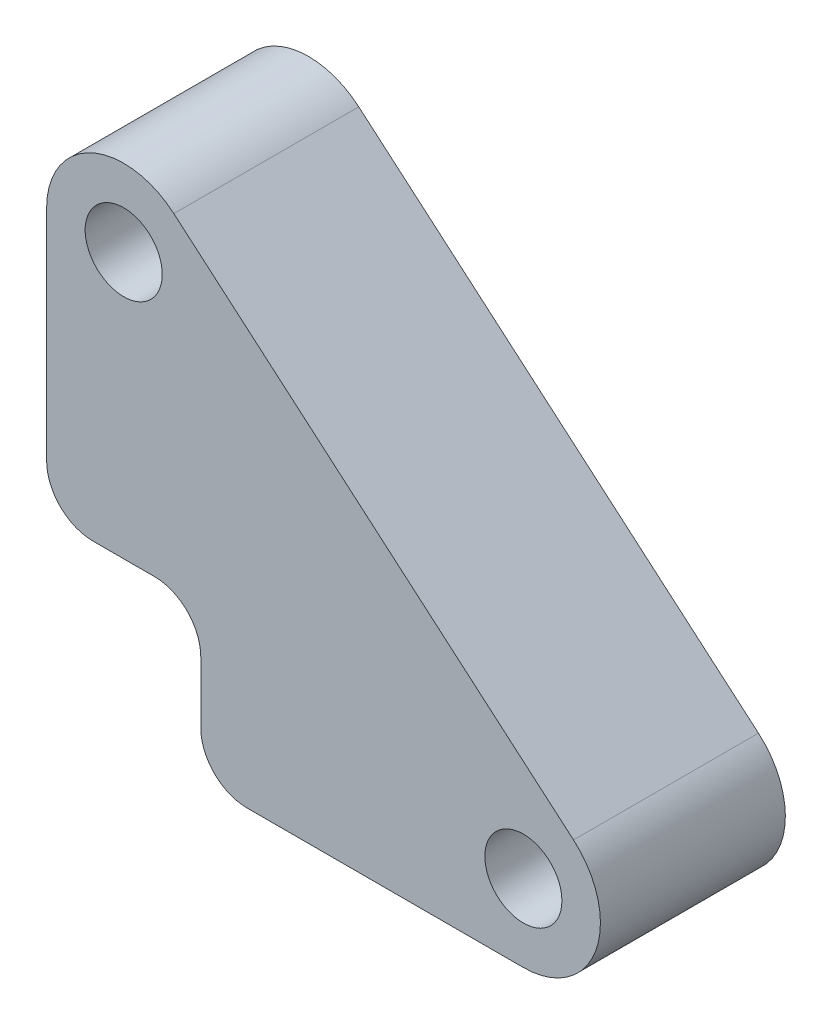
ISO-10303-21;
HEADER;
FILE_DESCRIPTION(('STEP AP214'),'2;1');
FILE_NAME('part.step','',(''),(''),'','','');
FILE_SCHEMA(('AUTOMOTIVE_DESIGN { 1 0 10303 214 1 1 1 1 }'));
ENDSEC;
DATA;
#1=APPLICATION_CONTEXT('core data for automotive mechanical design processes');
#2=APPLICATION_PROTOCOL_DEFINITION('international standard','automotive_design',2000,#1);
#3=PRODUCT_CONTEXT('',#1,'mechanical');
#4=PRODUCT('Part','Part','',(#3));
#5=PRODUCT_RELATED_PRODUCT_CATEGORY('part','',(#4));
#6=PRODUCT_DEFINITION_FORMATION('','',#4);
#7=PRODUCT_DEFINITION_CONTEXT('part definition',#1,'design');
#8=PRODUCT_DEFINITION('design','',#6,#7);
#9=PRODUCT_DEFINITION_SHAPE('','',#8);
#10=(LENGTH_UNIT() NAMED_UNIT(*) SI_UNIT(.MILLI.,.METRE.));
#11=(NAMED_UNIT(*) PLANE_ANGLE_UNIT() SI_UNIT($,.RADIAN.));
#12=(NAMED_UNIT(*) SI_UNIT($,.STERADIAN.) SOLID_ANGLE_UNIT());
#13=UNCERTAINTY_MEASURE_WITH_UNIT(LENGTH_MEASURE(1.E-05),#10,'distance_accuracy_value','');
#14=(GEOMETRIC_REPRESENTATION_CONTEXT(3) GLOBAL_UNCERTAINTY_ASSIGNED_CONTEXT((#13)) GLOBAL_UNIT_ASSIGNED_CONTEXT((#10,
#11,#12)) REPRESENTATION_CONTEXT('',''));
#15=CARTESIAN_POINT('',(0.,0.,0.));
#16=DIRECTION('',(0.,0.,1.));
#17=DIRECTION('',(1.,0.,0.));
#18=AXIS2_PLACEMENT_3D('',#15,#16,#17);
#19=CARTESIAN_POINT('',(61.8674259045119,0.,24.));
#20=DIRECTION('',(0.,1.,0.));
#21=DIRECTION('',(-1.,0.,0.));
#22=AXIS2_PLACEMENT_3D('',#19,#20,#21);
#23=PLANE('',#22);
#24=DIRECTION('',(1.,0.,0.));
#25=VECTOR('',#24,1.);
#26=CARTESIAN_POINT('',(61.8674259045119,0.,24.));
#27=LINE('',#26,#25);
#28=CARTESIAN_POINT('',(26.,0.,24.));
#29=VERTEX_POINT('',#28);
#30=CARTESIAN_POINT('',(61.8674259045119,0.,24.));
#31=VERTEX_POINT('',#30);
#32=EDGE_CURVE('E166',#29,#31,#27,.T.);
#33=ORIENTED_EDGE('',*,*,#32,.F.);
#34=DIRECTION('',(0.,0.,-1.));
#35=VECTOR('',#34,1.);
#36=CARTESIAN_POINT('',(26.,0.,24.));
#37=LINE('',#36,#35);
#38=CARTESIAN_POINT('',(26.,0.,0.));
#39=VERTEX_POINT('',#38);
#40=EDGE_CURVE('E47',#29,#39,#37,.T.);
#41=ORIENTED_EDGE('',*,*,#40,.T.);
#42=DIRECTION('',(1.,0.,0.));
#43=VECTOR('',#42,1.);
#44=CARTESIAN_POINT('',(61.8674259045119,0.,0.));
#45=LINE('',#44,#43);
#46=CARTESIAN_POINT('',(61.8674259045119,0.,0.));
#47=VERTEX_POINT('',#46);
#48=EDGE_CURVE('E156',#39,#47,#45,.T.);
#49=ORIENTED_EDGE('',*,*,#48,.T.);
#50=DIRECTION('',(0.,0.,-1.));
#51=VECTOR('',#50,1.);
#52=CARTESIAN_POINT('',(61.8674259045119,0.,24.));
#53=LINE('',#52,#51);
#54=EDGE_CURVE('E198',#31,#47,#53,.T.);
#55=ORIENTED_EDGE('',*,*,#54,.F.);
#56=EDGE_LOOP('',(#33,#41,#49,#55));
#57=FACE_BOUND('',#56,.T.);
#58=ADVANCED_FACE('F38',(#57),#23,.F.);
#59=CARTESIAN_POINT('',(61.8674259045119,10.,24.));
#60=DIRECTION('',(0.,0.,-1.));
#61=DIRECTION('',(-1.,0.,0.));
#62=AXIS2_PLACEMENT_3D('',#59,#60,#61);
#63=CYLINDRICAL_SURFACE('',#62,10.);
#64=CARTESIAN_POINT('',(61.8674259045119,10.,0.));
#65=DIRECTION('',(0.,0.,1.));
#66=DIRECTION('',(-1.,0.,0.));
#67=AXIS2_PLACEMENT_3D('',#64,#65,#66);
#68=CIRCLE('',#67,10.);
#69=CARTESIAN_POINT('',(68.3753396390715,17.592566023653,0.));
#70=VERTEX_POINT('',#69);
#71=EDGE_CURVE('E179',#47,#70,#68,.T.);
#72=ORIENTED_EDGE('',*,*,#71,.T.);
#73=DIRECTION('',(0.,0.,-1.));
#74=VECTOR('',#73,1.);
#75=CARTESIAN_POINT('',(68.3753396390715,17.592566023653,24.));
#76=LINE('',#75,#74);
#77=CARTESIAN_POINT('',(68.3753396390715,17.592566023653,24.));
#78=VERTEX_POINT('',#77);
#79=EDGE_CURVE('E194',#78,#70,#76,.T.);
#80=ORIENTED_EDGE('',*,*,#79,.F.);
#81=CARTESIAN_POINT('',(61.8674259045119,10.,24.));
#82=DIRECTION('',(0.,0.,1.));
#83=DIRECTION('',(-1.,0.,0.));
#84=AXIS2_PLACEMENT_3D('',#81,#82,#83);
#85=CIRCLE('',#84,10.);
#86=EDGE_CURVE('E168',#31,#78,#85,.T.);
#87=ORIENTED_EDGE('',*,*,#86,.F.);
#88=ORIENTED_EDGE('',*,*,#54,.T.);
#89=EDGE_LOOP('',(#72,#80,#87,#88));
#90=FACE_BOUND('',#89,.T.);
#91=ADVANCED_FACE('F225',(#90),#63,.T.);
#92=CARTESIAN_POINT('',(16.5079137345597,62.0503596560917,24.));
#93=DIRECTION('',(-0.650791373455969,-0.759256602365296,0.));
#94=DIRECTION('',(0.759256602365296,-0.650791373455969,0.));
#95=AXIS2_PLACEMENT_3D('',#92,#93,#94);
#96=PLANE('',#95);
#97=DIRECTION('',(-0.759256602365296,0.650791373455969,0.));
#98=VECTOR('',#97,1.);
#99=CARTESIAN_POINT('',(16.5079137345597,62.0503596560917,0.));
#100=LINE('',#99,#98);
#101=CARTESIAN_POINT('',(16.5079137345597,62.0503596560917,0.));
#102=VERTEX_POINT('',#101);
#103=EDGE_CURVE('E182',#70,#102,#100,.T.);
#104=ORIENTED_EDGE('',*,*,#103,.T.);
#105=DIRECTION('',(0.,0.,-1.));
#106=VECTOR('',#105,1.);
#107=CARTESIAN_POINT('',(16.5079137345597,62.0503596560917,24.));
#108=LINE('',#107,#106);
#109=CARTESIAN_POINT('',(16.5079137345597,62.0503596560917,24.));
#110=VERTEX_POINT('',#109);
#111=EDGE_CURVE('E191',#110,#102,#108,.T.);
#112=ORIENTED_EDGE('',*,*,#111,.F.);
#113=DIRECTION('',(-0.759256602365296,0.650791373455969,0.));
#114=VECTOR('',#113,1.);
#115=CARTESIAN_POINT('',(16.5079137345597,62.0503596560917,24.));
#116=LINE('',#115,#114);
#117=EDGE_CURVE('E171',#78,#110,#116,.T.);
#118=ORIENTED_EDGE('',*,*,#117,.F.);
#119=ORIENTED_EDGE('',*,*,#79,.T.);
#120=EDGE_LOOP('',(#104,#112,#118,#119));
#121=FACE_BOUND('',#120,.T.);
#122=ADVANCED_FACE('F229',(#121),#96,.F.);
#123=CARTESIAN_POINT('',(10.,54.4577936324387,24.));
#124=DIRECTION('',(0.,0.,-1.));
#125=DIRECTION('',(-1.,0.,0.));
#126=AXIS2_PLACEMENT_3D('',#123,#124,#125);
#127=CYLINDRICAL_SURFACE('',#126,10.);
#128=CARTESIAN_POINT('',(10.,54.4577936324387,0.));
#129=DIRECTION('',(0.,0.,1.));
#130=DIRECTION('',(-1.,0.,0.));
#131=AXIS2_PLACEMENT_3D('',#128,#129,#130);
#132=CIRCLE('',#131,10.);
#133=CARTESIAN_POINT('',(0.,54.4577936324387,0.));
#134=VERTEX_POINT('',#133);
#135=EDGE_CURVE('E185',#102,#134,#132,.T.);
#136=ORIENTED_EDGE('',*,*,#135,.T.);
#137=DIRECTION('',(0.,0.,-1.));
#138=VECTOR('',#137,1.);
#139=CARTESIAN_POINT('',(0.,54.4577936324387,24.));
#140=LINE('',#139,#138);
#141=CARTESIAN_POINT('',(0.,54.4577936324387,24.));
#142=VERTEX_POINT('',#141);
#143=EDGE_CURVE('E177',#142,#134,#140,.T.);
#144=ORIENTED_EDGE('',*,*,#143,.F.);
#145=CARTESIAN_POINT('',(10.,54.4577936324387,24.));
#146=DIRECTION('',(0.,0.,1.));
#147=DIRECTION('',(-1.,0.,0.));
#148=AXIS2_PLACEMENT_3D('',#145,#146,#147);
#149=CIRCLE('',#148,10.);
#150=EDGE_CURVE('E173',#110,#142,#149,.T.);
#151=ORIENTED_EDGE('',*,*,#150,.F.);
#152=ORIENTED_EDGE('',*,*,#111,.T.);
#153=EDGE_LOOP('',(#136,#144,#151,#152));
#154=FACE_BOUND('',#153,.T.);
#155=ADVANCED_FACE('F235',(#154),#127,.T.);
#156=CARTESIAN_POINT('',(0.,10.0000000000001,24.));
#157=DIRECTION('',(1.,0.,0.));
#158=DIRECTION('',(0.,0.,-1.));
#159=AXIS2_PLACEMENT_3D('',#156,#157,#158);
#160=PLANE('',#159);
#161=DIRECTION('',(0.,-1.,0.));
#162=VECTOR('',#161,1.);
#163=CARTESIAN_POINT('',(0.,10.0000000000001,0.));
#164=LINE('',#163,#162);
#165=CARTESIAN_POINT('',(0.,26.,0.));
#166=VERTEX_POINT('',#165);
#167=EDGE_CURVE('E169',#134,#166,#164,.T.);
#168=ORIENTED_EDGE('',*,*,#167,.T.);
#169=DIRECTION('',(0.,0.,-1.));
#170=VECTOR('',#169,1.);
#171=CARTESIAN_POINT('',(0.,26.,24.));
#172=LINE('',#171,#170);
#173=CARTESIAN_POINT('',(0.,26.,24.));
#174=VERTEX_POINT('',#173);
#175=EDGE_CURVE('E208',#166,#174,#172,.F.);
#176=ORIENTED_EDGE('',*,*,#175,.T.);
#177=DIRECTION('',(0.,-1.,0.));
#178=VECTOR('',#177,1.);
#179=CARTESIAN_POINT('',(0.,10.0000000000001,24.));
#180=LINE('',#179,#178);
#181=EDGE_CURVE('E175',#142,#174,#180,.T.);
#182=ORIENTED_EDGE('',*,*,#181,.F.);
#183=ORIENTED_EDGE('',*,*,#143,.T.);
#184=EDGE_LOOP('',(#168,#176,#182,#183));
#185=FACE_BOUND('',#184,.T.);
#186=ADVANCED_FACE('F238',(#185),#160,.F.);
#187=CARTESIAN_POINT('',(10.,10.,24.));
#188=DIRECTION('',(0.,0.,1.));
#189=DIRECTION('',(1.,0.,0.));
#190=AXIS2_PLACEMENT_3D('',#187,#188,#189);
#191=PLANE('',#190);
#192=ORIENTED_EDGE('',*,*,#181,.T.);
#193=CARTESIAN_POINT('',(6.,26.,24.));
#194=DIRECTION('',(0.,0.,1.));
#195=DIRECTION('',(1.,0.,0.));
#196=AXIS2_PLACEMENT_3D('',#193,#194,#195);
#197=CIRCLE('',#196,6.);
#198=CARTESIAN_POINT('',(6.00000000000001,20.,24.));
#199=VERTEX_POINT('',#198);
#200=EDGE_CURVE('E125',#174,#199,#197,.T.);
#201=ORIENTED_EDGE('',*,*,#200,.T.);
#202=DIRECTION('',(1.,0.,0.));
#203=VECTOR('',#202,1.);
#204=CARTESIAN_POINT('',(0.,20.,24.));
#205=LINE('',#204,#203);
#206=CARTESIAN_POINT('',(14.,20.,24.));
#207=VERTEX_POINT('',#206);
#208=EDGE_CURVE('E117',#199,#207,#205,.T.);
#209=ORIENTED_EDGE('',*,*,#208,.T.);
#210=CARTESIAN_POINT('',(14.,14.,24.));
#211=DIRECTION('',(0.,0.,-1.));
#212=DIRECTION('',(1.,0.,0.));
#213=AXIS2_PLACEMENT_3D('',#210,#211,#212);
#214=CIRCLE('',#213,6.);
#215=CARTESIAN_POINT('',(20.,14.,24.));
#216=VERTEX_POINT('',#215);
#217=EDGE_CURVE('E123',#207,#216,#214,.T.);
#218=ORIENTED_EDGE('',*,*,#217,.T.);
#219=DIRECTION('',(0.,-1.,0.));
#220=VECTOR('',#219,1.);
#221=CARTESIAN_POINT('',(20.,0.,24.));
#222=LINE('',#221,#220);
#223=CARTESIAN_POINT('',(20.,6.,24.));
#224=VERTEX_POINT('',#223);
#225=EDGE_CURVE('E140',#216,#224,#222,.T.);
#226=ORIENTED_EDGE('',*,*,#225,.T.);
#227=CARTESIAN_POINT('',(26.,6.,24.));
#228=DIRECTION('',(0.,0.,1.));
#229=DIRECTION('',(1.,0.,0.));
#230=AXIS2_PLACEMENT_3D('',#227,#228,#229);
#231=CIRCLE('',#230,6.);
#232=EDGE_CURVE('E54',#224,#29,#231,.T.);
#233=ORIENTED_EDGE('',*,*,#232,.T.);
#234=ORIENTED_EDGE('',*,*,#32,.T.);
#235=ORIENTED_EDGE('',*,*,#86,.T.);
#236=ORIENTED_EDGE('',*,*,#117,.T.);
#237=ORIENTED_EDGE('',*,*,#150,.T.);
#238=EDGE_LOOP('',(#192,#201,#209,#218,#226,#233,#234,#235,#236,#237));
#239=FACE_BOUND('',#238,.T.);
#240=CARTESIAN_POINT('',(10.,54.4577936324387,24.));
#241=DIRECTION('',(0.,0.,1.));
#242=DIRECTION('',(1.,0.,0.));
#243=AXIS2_PLACEMENT_3D('',#240,#241,#242);
#244=CIRCLE('',#243,5.);
#245=CARTESIAN_POINT('',(15.,54.4577936324387,24.));
#246=VERTEX_POINT('',#245);
#247=EDGE_CURVE('E157',#246,#246,#244,.T.);
#248=ORIENTED_EDGE('',*,*,#247,.F.);
#249=EDGE_LOOP('',(#248));
#250=FACE_BOUND('',#249,.T.);
#251=CARTESIAN_POINT('',(61.8674259045119,10.,24.));
#252=DIRECTION('',(0.,0.,1.));
#253=DIRECTION('',(1.,0.,0.));
#254=AXIS2_PLACEMENT_3D('',#251,#252,#253);
#255=CIRCLE('',#254,5.);
#256=CARTESIAN_POINT('',(66.8674259045119,10.,24.));
#257=VERTEX_POINT('',#256);
#258=EDGE_CURVE('E151',#257,#257,#255,.T.);
#259=ORIENTED_EDGE('',*,*,#258,.F.);
#260=EDGE_LOOP('',(#259));
#261=FACE_BOUND('',#260,.T.);
#262=ADVANCED_FACE('F120',(#239,#250,#261),#191,.T.);
#263=CARTESIAN_POINT('',(10.,10.,0.));
#264=DIRECTION('',(0.,0.,1.));
#265=DIRECTION('',(1.,0.,0.));
#266=AXIS2_PLACEMENT_3D('',#263,#264,#265);
#267=PLANE('',#266);
#268=CARTESIAN_POINT('',(10.,54.4577936324387,0.));
#269=DIRECTION('',(0.,0.,1.));
#270=DIRECTION('',(1.,0.,0.));
#271=AXIS2_PLACEMENT_3D('',#268,#269,#270);
#272=CIRCLE('',#271,5.);
#273=CARTESIAN_POINT('',(15.,54.4577936324387,0.));
#274=VERTEX_POINT('',#273);
#275=EDGE_CURVE('E153',#274,#274,#272,.T.);
#276=ORIENTED_EDGE('',*,*,#275,.T.);
#277=EDGE_LOOP('',(#276));
#278=FACE_BOUND('',#277,.T.);
#279=CARTESIAN_POINT('',(61.8674259045119,10.,0.));
#280=DIRECTION('',(0.,0.,1.));
#281=DIRECTION('',(1.,0.,0.));
#282=AXIS2_PLACEMENT_3D('',#279,#280,#281);
#283=CIRCLE('',#282,5.);
#284=CARTESIAN_POINT('',(66.8674259045119,10.,0.));
#285=VERTEX_POINT('',#284);
#286=EDGE_CURVE('E160',#285,#285,#283,.T.);
#287=ORIENTED_EDGE('',*,*,#286,.T.);
#288=EDGE_LOOP('',(#287));
#289=FACE_BOUND('',#288,.T.);
#290=DIRECTION('',(1.,0.,0.));
#291=VECTOR('',#290,1.);
#292=CARTESIAN_POINT('',(0.,20.,0.));
#293=LINE('',#292,#291);
#294=CARTESIAN_POINT('',(6.00000000000001,20.,0.));
#295=VERTEX_POINT('',#294);
#296=CARTESIAN_POINT('',(14.,20.,0.));
#297=VERTEX_POINT('',#296);
#298=EDGE_CURVE('E135',#295,#297,#293,.T.);
#299=ORIENTED_EDGE('',*,*,#298,.F.);
#300=CARTESIAN_POINT('',(6.,26.,0.));
#301=DIRECTION('',(0.,0.,1.));
#302=DIRECTION('',(1.,0.,0.));
#303=AXIS2_PLACEMENT_3D('',#300,#301,#302);
#304=CIRCLE('',#303,6.);
#305=EDGE_CURVE('E206',#295,#166,#304,.F.);
#306=ORIENTED_EDGE('',*,*,#305,.T.);
#307=ORIENTED_EDGE('',*,*,#167,.F.);
#308=ORIENTED_EDGE('',*,*,#135,.F.);
#309=ORIENTED_EDGE('',*,*,#103,.F.);
#310=ORIENTED_EDGE('',*,*,#71,.F.);
#311=ORIENTED_EDGE('',*,*,#48,.F.);
#312=CARTESIAN_POINT('',(26.,6.,0.));
#313=DIRECTION('',(0.,0.,1.));
#314=DIRECTION('',(1.,0.,0.));
#315=AXIS2_PLACEMENT_3D('',#312,#313,#314);
#316=CIRCLE('',#315,6.);
#317=CARTESIAN_POINT('',(20.,6.,0.));
#318=VERTEX_POINT('',#317);
#319=EDGE_CURVE('E203',#39,#318,#316,.F.);
#320=ORIENTED_EDGE('',*,*,#319,.T.);
#321=DIRECTION('',(0.,-1.,0.));
#322=VECTOR('',#321,1.);
#323=CARTESIAN_POINT('',(20.,0.,0.));
#324=LINE('',#323,#322);
#325=CARTESIAN_POINT('',(20.,14.,0.));
#326=VERTEX_POINT('',#325);
#327=EDGE_CURVE('E129',#326,#318,#324,.T.);
#328=ORIENTED_EDGE('',*,*,#327,.F.);
#329=CARTESIAN_POINT('',(14.,14.,0.));
#330=DIRECTION('',(0.,0.,-1.));
#331=DIRECTION('',(1.,0.,0.));
#332=AXIS2_PLACEMENT_3D('',#329,#330,#331);
#333=CIRCLE('',#332,6.);
#334=EDGE_CURVE('E147',#297,#326,#333,.T.);
#335=ORIENTED_EDGE('',*,*,#334,.F.);
#336=EDGE_LOOP('',(#299,#306,#307,#308,#309,#310,#311,#320,#328,#335));
#337=FACE_BOUND('',#336,.T.);
#338=ADVANCED_FACE('F219',(#278,#289,#337),#267,.F.);
#339=CARTESIAN_POINT('',(61.8674259045119,10.,0.));
#340=DIRECTION('',(0.,0.,1.));
#341=DIRECTION('',(1.,0.,0.));
#342=AXIS2_PLACEMENT_3D('',#339,#340,#341);
#343=CYLINDRICAL_SURFACE('',#342,5.);
#344=ORIENTED_EDGE('',*,*,#286,.F.);
#345=EDGE_LOOP('',(#344));
#346=FACE_BOUND('',#345,.T.);
#347=ORIENTED_EDGE('',*,*,#258,.T.);
#348=EDGE_LOOP('',(#347));
#349=FACE_BOUND('',#348,.T.);
#350=ADVANCED_FACE('F262',(#346,#349),#343,.F.);
#351=CARTESIAN_POINT('',(10.,54.4577936324387,0.));
#352=DIRECTION('',(0.,0.,1.));
#353=DIRECTION('',(1.,0.,0.));
#354=AXIS2_PLACEMENT_3D('',#351,#352,#353);
#355=CYLINDRICAL_SURFACE('',#354,5.);
#356=ORIENTED_EDGE('',*,*,#275,.F.);
#357=EDGE_LOOP('',(#356));
#358=FACE_BOUND('',#357,.T.);
#359=ORIENTED_EDGE('',*,*,#247,.T.);
#360=EDGE_LOOP('',(#359));
#361=FACE_BOUND('',#360,.T.);
#362=ADVANCED_FACE('F268',(#358,#361),#355,.F.);
#363=CARTESIAN_POINT('',(20.,0.,24.));
#364=DIRECTION('',(1.,0.,0.));
#365=DIRECTION('',(0.,1.,0.));
#366=AXIS2_PLACEMENT_3D('',#363,#364,#365);
#367=PLANE('',#366);
#368=ORIENTED_EDGE('',*,*,#327,.T.);
#369=DIRECTION('',(0.,0.,-1.));
#370=VECTOR('',#369,1.);
#371=CARTESIAN_POINT('',(20.,6.,24.));
#372=LINE('',#371,#370);
#373=EDGE_CURVE('E11',#318,#224,#372,.F.);
#374=ORIENTED_EDGE('',*,*,#373,.T.);
#375=ORIENTED_EDGE('',*,*,#225,.F.);
#376=DIRECTION('',(0.,0.,-1.));
#377=VECTOR('',#376,1.);
#378=CARTESIAN_POINT('',(20.,14.,24.));
#379=LINE('',#378,#377);
#380=EDGE_CURVE('E139',#216,#326,#379,.T.);
#381=ORIENTED_EDGE('',*,*,#380,.T.);
#382=EDGE_LOOP('',(#368,#374,#375,#381));
#383=FACE_BOUND('',#382,.T.);
#384=ADVANCED_FACE('F242',(#383),#367,.F.);
#385=CARTESIAN_POINT('',(14.,14.,24.));
#386=DIRECTION('',(0.,0.,-1.));
#387=DIRECTION('',(-1.,0.,0.));
#388=AXIS2_PLACEMENT_3D('',#385,#386,#387);
#389=CYLINDRICAL_SURFACE('',#388,6.);
#390=ORIENTED_EDGE('',*,*,#334,.T.);
#391=ORIENTED_EDGE('',*,*,#380,.F.);
#392=ORIENTED_EDGE('',*,*,#217,.F.);
#393=DIRECTION('',(0.,0.,-1.));
#394=VECTOR('',#393,1.);
#395=CARTESIAN_POINT('',(14.,20.,24.));
#396=LINE('',#395,#394);
#397=EDGE_CURVE('E132',#207,#297,#396,.T.);
#398=ORIENTED_EDGE('',*,*,#397,.T.);
#399=EDGE_LOOP('',(#390,#391,#392,#398));
#400=FACE_BOUND('',#399,.T.);
#401=ADVANCED_FACE('F142',(#400),#389,.F.);
#402=CARTESIAN_POINT('',(0.,20.,24.));
#403=DIRECTION('',(0.,1.,0.));
#404=DIRECTION('',(-1.,0.,0.));
#405=AXIS2_PLACEMENT_3D('',#402,#403,#404);
#406=PLANE('',#405);
#407=ORIENTED_EDGE('',*,*,#208,.F.);
#408=DIRECTION('',(0.,0.,-1.));
#409=VECTOR('',#408,1.);
#410=CARTESIAN_POINT('',(6.00000000000001,20.,24.));
#411=LINE('',#410,#409);
#412=EDGE_CURVE('E201',#199,#295,#411,.T.);
#413=ORIENTED_EDGE('',*,*,#412,.T.);
#414=ORIENTED_EDGE('',*,*,#298,.T.);
#415=ORIENTED_EDGE('',*,*,#397,.F.);
#416=EDGE_LOOP('',(#407,#413,#414,#415));
#417=FACE_BOUND('',#416,.T.);
#418=ADVANCED_FACE('F133',(#417),#406,.F.);
#419=CARTESIAN_POINT('',(6.,26.,24.));
#420=DIRECTION('',(0.,0.,-1.));
#421=DIRECTION('',(-1.,0.,0.));
#422=AXIS2_PLACEMENT_3D('',#419,#420,#421);
#423=CYLINDRICAL_SURFACE('',#422,6.);
#424=ORIENTED_EDGE('',*,*,#200,.F.);
#425=ORIENTED_EDGE('',*,*,#175,.F.);
#426=ORIENTED_EDGE('',*,*,#305,.F.);
#427=ORIENTED_EDGE('',*,*,#412,.F.);
#428=EDGE_LOOP('',(#424,#425,#426,#427));
#429=FACE_BOUND('',#428,.T.);
#430=ADVANCED_FACE('F241',(#429),#423,.T.);
#431=CARTESIAN_POINT('',(26.,6.,24.));
#432=DIRECTION('',(0.,0.,-1.));
#433=DIRECTION('',(-1.,0.,0.));
#434=AXIS2_PLACEMENT_3D('',#431,#432,#433);
#435=CYLINDRICAL_SURFACE('',#434,6.);
#436=ORIENTED_EDGE('',*,*,#232,.F.);
#437=ORIENTED_EDGE('',*,*,#373,.F.);
#438=ORIENTED_EDGE('',*,*,#319,.F.);
#439=ORIENTED_EDGE('',*,*,#40,.F.);
#440=EDGE_LOOP('',(#436,#437,#438,#439));
#441=FACE_BOUND('',#440,.T.);
#442=ADVANCED_FACE('F40',(#441),#435,.T.);
#443=CLOSED_SHELL('',(#58,#91,#122,#155,#186,#262,#338,#350,#362,#384,#401,#418,#430,#442));
#444=MANIFOLD_SOLID_BREP('B2',#443);
#445=ADVANCED_BREP_SHAPE_REPRESENTATION('',(#18,#444),#14);
#446=SHAPE_DEFINITION_REPRESENTATION(#9,#445);
ENDSEC;
END-ISO-10303-21;
